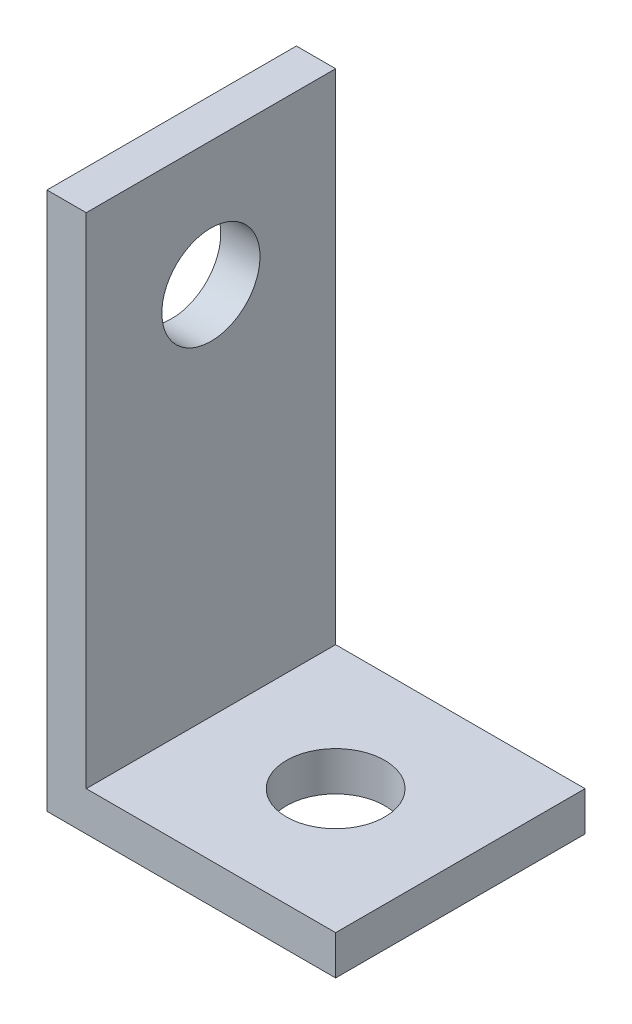
ISO-10303-21;
HEADER;
FILE_DESCRIPTION(('STEP AP214'),'2;1');
FILE_NAME('part.step','',(''),(''),'','','');
FILE_SCHEMA(('AUTOMOTIVE_DESIGN { 1 0 10303 214 1 1 1 1 }'));
ENDSEC;
DATA;
#1=APPLICATION_CONTEXT('core data for automotive mechanical design processes');
#2=APPLICATION_PROTOCOL_DEFINITION('international standard','automotive_design',2000,#1);
#3=PRODUCT_CONTEXT('',#1,'mechanical');
#4=PRODUCT('Part','Part','',(#3));
#5=PRODUCT_RELATED_PRODUCT_CATEGORY('part','',(#4));
#6=PRODUCT_DEFINITION_FORMATION('','',#4);
#7=PRODUCT_DEFINITION_CONTEXT('part definition',#1,'design');
#8=PRODUCT_DEFINITION('design','',#6,#7);
#9=PRODUCT_DEFINITION_SHAPE('','',#8);
#10=(LENGTH_UNIT() NAMED_UNIT(*) SI_UNIT(.MILLI.,.METRE.));
#11=(NAMED_UNIT(*) PLANE_ANGLE_UNIT() SI_UNIT($,.RADIAN.));
#12=(NAMED_UNIT(*) SI_UNIT($,.STERADIAN.) SOLID_ANGLE_UNIT());
#13=UNCERTAINTY_MEASURE_WITH_UNIT(LENGTH_MEASURE(1.E-05),#10,'distance_accuracy_value','');
#14=(GEOMETRIC_REPRESENTATION_CONTEXT(3) GLOBAL_UNCERTAINTY_ASSIGNED_CONTEXT((#13)) GLOBAL_UNIT_ASSIGNED_CONTEXT((#10,
#11,#12)) REPRESENTATION_CONTEXT('',''));
#15=CARTESIAN_POINT('',(0.,0.,0.));
#16=DIRECTION('',(0.,0.,1.));
#17=DIRECTION('',(1.,0.,0.));
#18=AXIS2_PLACEMENT_3D('',#15,#16,#17);
#19=CARTESIAN_POINT('',(0.,0.,12.7));
#20=DIRECTION('',(0.,1.,0.));
#21=DIRECTION('',(0.,0.,1.));
#22=AXIS2_PLACEMENT_3D('',#19,#20,#21);
#23=PLANE('',#22);
#24=CARTESIAN_POINT('',(8.35,0.,6.35));
#25=DIRECTION('',(0.,1.,0.));
#26=DIRECTION('',(0.,0.,1.));
#27=AXIS2_PLACEMENT_3D('',#24,#25,#26);
#28=CIRCLE('',#27,2.5);
#29=CARTESIAN_POINT('',(8.35,0.,8.85));
#30=VERTEX_POINT('',#29);
#31=EDGE_CURVE('E132',#30,#30,#28,.T.);
#32=ORIENTED_EDGE('',*,*,#31,.T.);
#33=EDGE_LOOP('',(#32));
#34=FACE_BOUND('',#33,.T.);
#35=DIRECTION('',(1.,0.,0.));
#36=VECTOR('',#35,1.);
#37=CARTESIAN_POINT('',(0.,0.,0.));
#38=LINE('',#37,#36);
#39=CARTESIAN_POINT('',(0.,0.,0.));
#40=VERTEX_POINT('',#39);
#41=CARTESIAN_POINT('',(14.7,0.,0.));
#42=VERTEX_POINT('',#41);
#43=EDGE_CURVE('E83',#40,#42,#38,.T.);
#44=ORIENTED_EDGE('',*,*,#43,.T.);
#45=DIRECTION('',(0.,0.,-1.));
#46=VECTOR('',#45,1.);
#47=CARTESIAN_POINT('',(14.7,0.,12.7));
#48=LINE('',#47,#46);
#49=CARTESIAN_POINT('',(14.7,0.,12.7));
#50=VERTEX_POINT('',#49);
#51=EDGE_CURVE('E45',#50,#42,#48,.T.);
#52=ORIENTED_EDGE('',*,*,#51,.F.);
#53=DIRECTION('',(1.,0.,0.));
#54=VECTOR('',#53,1.);
#55=CARTESIAN_POINT('',(0.,0.,12.7));
#56=LINE('',#55,#54);
#57=CARTESIAN_POINT('',(0.,0.,12.7));
#58=VERTEX_POINT('',#57);
#59=EDGE_CURVE('E86',#58,#50,#56,.T.);
#60=ORIENTED_EDGE('',*,*,#59,.F.);
#61=DIRECTION('',(0.,0.,-1.));
#62=VECTOR('',#61,1.);
#63=CARTESIAN_POINT('',(0.,0.,12.7));
#64=LINE('',#63,#62);
#65=EDGE_CURVE('E113',#58,#40,#64,.T.);
#66=ORIENTED_EDGE('',*,*,#65,.T.);
#67=EDGE_LOOP('',(#44,#52,#60,#66));
#68=FACE_BOUND('',#67,.T.);
#69=ADVANCED_FACE('F35',(#34,#68),#23,.F.);
#70=CARTESIAN_POINT('',(14.7,0.,12.7));
#71=DIRECTION('',(-1.,0.,0.));
#72=DIRECTION('',(0.,0.,1.));
#73=AXIS2_PLACEMENT_3D('',#70,#71,#72);
#74=PLANE('',#73);
#75=DIRECTION('',(0.,1.,0.));
#76=VECTOR('',#75,1.);
#77=CARTESIAN_POINT('',(14.7,0.,0.));
#78=LINE('',#77,#76);
#79=CARTESIAN_POINT('',(14.7,2.,0.));
#80=VERTEX_POINT('',#79);
#81=EDGE_CURVE('E118',#42,#80,#78,.T.);
#82=ORIENTED_EDGE('',*,*,#81,.T.);
#83=DIRECTION('',(0.,0.,-1.));
#84=VECTOR('',#83,1.);
#85=CARTESIAN_POINT('',(14.7,2.,12.7));
#86=LINE('',#85,#84);
#87=CARTESIAN_POINT('',(14.7,2.,12.7));
#88=VERTEX_POINT('',#87);
#89=EDGE_CURVE('E110',#88,#80,#86,.T.);
#90=ORIENTED_EDGE('',*,*,#89,.F.);
#91=DIRECTION('',(0.,1.,0.));
#92=VECTOR('',#91,1.);
#93=CARTESIAN_POINT('',(14.7,0.,12.7));
#94=LINE('',#93,#92);
#95=EDGE_CURVE('E125',#50,#88,#94,.T.);
#96=ORIENTED_EDGE('',*,*,#95,.F.);
#97=ORIENTED_EDGE('',*,*,#51,.T.);
#98=EDGE_LOOP('',(#82,#90,#96,#97));
#99=FACE_BOUND('',#98,.T.);
#100=ADVANCED_FACE('F143',(#99),#74,.F.);
#101=CARTESIAN_POINT('',(0.,2.,12.7));
#102=DIRECTION('',(0.,1.,0.));
#103=DIRECTION('',(0.,0.,1.));
#104=AXIS2_PLACEMENT_3D('',#101,#102,#103);
#105=PLANE('',#104);
#106=CARTESIAN_POINT('',(8.35,2.,6.35));
#107=DIRECTION('',(0.,1.,0.));
#108=DIRECTION('',(0.,0.,1.));
#109=AXIS2_PLACEMENT_3D('',#106,#107,#108);
#110=CIRCLE('',#109,2.49999999999999);
#111=CARTESIAN_POINT('',(8.35,2.,8.84999999999999));
#112=VERTEX_POINT('',#111);
#113=EDGE_CURVE('E135',#112,#112,#110,.T.);
#114=ORIENTED_EDGE('',*,*,#113,.F.);
#115=EDGE_LOOP('',(#114));
#116=FACE_BOUND('',#115,.T.);
#117=DIRECTION('',(0.,0.,-1.));
#118=VECTOR('',#117,1.);
#119=CARTESIAN_POINT('',(2.,2.,12.7));
#120=LINE('',#119,#118);
#121=CARTESIAN_POINT('',(2.,2.,12.7));
#122=VERTEX_POINT('',#121);
#123=CARTESIAN_POINT('',(2.,2.,0.));
#124=VERTEX_POINT('',#123);
#125=EDGE_CURVE('E11',#122,#124,#120,.T.);
#126=ORIENTED_EDGE('',*,*,#125,.F.);
#127=DIRECTION('',(1.,0.,0.));
#128=VECTOR('',#127,1.);
#129=CARTESIAN_POINT('',(0.,2.,12.7));
#130=LINE('',#129,#128);
#131=EDGE_CURVE('E123',#122,#88,#130,.T.);
#132=ORIENTED_EDGE('',*,*,#131,.T.);
#133=ORIENTED_EDGE('',*,*,#89,.T.);
#134=DIRECTION('',(1.,0.,0.));
#135=VECTOR('',#134,1.);
#136=CARTESIAN_POINT('',(0.,2.,0.));
#137=LINE('',#136,#135);
#138=EDGE_CURVE('E87',#124,#80,#137,.T.);
#139=ORIENTED_EDGE('',*,*,#138,.F.);
#140=EDGE_LOOP('',(#126,#132,#133,#139));
#141=FACE_BOUND('',#140,.T.);
#142=ADVANCED_FACE('F141',(#116,#141),#105,.T.);
#143=CARTESIAN_POINT('',(0.,0.,12.7));
#144=DIRECTION('',(-1.,0.,0.));
#145=DIRECTION('',(0.,0.,1.));
#146=AXIS2_PLACEMENT_3D('',#143,#144,#145);
#147=PLANE('',#146);
#148=CARTESIAN_POINT('',(0.,21.05,6.35));
#149=DIRECTION('',(1.,0.,0.));
#150=DIRECTION('',(0.,0.,-1.));
#151=AXIS2_PLACEMENT_3D('',#148,#149,#150);
#152=CIRCLE('',#151,2.5);
#153=CARTESIAN_POINT('',(0.,21.05,3.85));
#154=VERTEX_POINT('',#153);
#155=EDGE_CURVE('E97',#154,#154,#152,.T.);
#156=ORIENTED_EDGE('',*,*,#155,.T.);
#157=EDGE_LOOP('',(#156));
#158=FACE_BOUND('',#157,.T.);
#159=DIRECTION('',(0.,1.,0.));
#160=VECTOR('',#159,1.);
#161=CARTESIAN_POINT('',(0.,0.,0.));
#162=LINE('',#161,#160);
#163=CARTESIAN_POINT('',(0.,27.4,0.));
#164=VERTEX_POINT('',#163);
#165=EDGE_CURVE('E75',#40,#164,#162,.T.);
#166=ORIENTED_EDGE('',*,*,#165,.F.);
#167=ORIENTED_EDGE('',*,*,#65,.F.);
#168=DIRECTION('',(0.,1.,0.));
#169=VECTOR('',#168,1.);
#170=CARTESIAN_POINT('',(0.,0.,12.7));
#171=LINE('',#170,#169);
#172=CARTESIAN_POINT('',(0.,27.4,12.7));
#173=VERTEX_POINT('',#172);
#174=EDGE_CURVE('E93',#58,#173,#171,.T.);
#175=ORIENTED_EDGE('',*,*,#174,.T.);
#176=DIRECTION('',(0.,0.,-1.));
#177=VECTOR('',#176,1.);
#178=CARTESIAN_POINT('',(0.,27.4,12.7));
#179=LINE('',#178,#177);
#180=EDGE_CURVE('E90',#173,#164,#179,.T.);
#181=ORIENTED_EDGE('',*,*,#180,.T.);
#182=EDGE_LOOP('',(#166,#167,#175,#181));
#183=FACE_BOUND('',#182,.T.);
#184=ADVANCED_FACE('F91',(#158,#183),#147,.T.);
#185=CARTESIAN_POINT('',(0.,0.,12.7));
#186=DIRECTION('',(0.,0.,1.));
#187=DIRECTION('',(1.,0.,0.));
#188=AXIS2_PLACEMENT_3D('',#185,#186,#187);
#189=PLANE('',#188);
#190=ORIENTED_EDGE('',*,*,#59,.T.);
#191=ORIENTED_EDGE('',*,*,#95,.T.);
#192=ORIENTED_EDGE('',*,*,#131,.F.);
#193=DIRECTION('',(0.,1.,0.));
#194=VECTOR('',#193,1.);
#195=CARTESIAN_POINT('',(2.,2.,12.7));
#196=LINE('',#195,#194);
#197=CARTESIAN_POINT('',(2.,27.4,12.7));
#198=VERTEX_POINT('',#197);
#199=EDGE_CURVE('E105',#122,#198,#196,.T.);
#200=ORIENTED_EDGE('',*,*,#199,.T.);
#201=DIRECTION('',(1.,0.,0.));
#202=VECTOR('',#201,1.);
#203=CARTESIAN_POINT('',(0.,27.4,12.7));
#204=LINE('',#203,#202);
#205=EDGE_CURVE('E99',#173,#198,#204,.T.);
#206=ORIENTED_EDGE('',*,*,#205,.F.);
#207=ORIENTED_EDGE('',*,*,#174,.F.);
#208=EDGE_LOOP('',(#190,#191,#192,#200,#206,#207));
#209=FACE_BOUND('',#208,.T.);
#210=ADVANCED_FACE('F149',(#209),#189,.T.);
#211=CARTESIAN_POINT('',(0.,0.,0.));
#212=DIRECTION('',(0.,0.,1.));
#213=DIRECTION('',(1.,0.,0.));
#214=AXIS2_PLACEMENT_3D('',#211,#212,#213);
#215=PLANE('',#214);
#216=ORIENTED_EDGE('',*,*,#43,.F.);
#217=ORIENTED_EDGE('',*,*,#165,.T.);
#218=DIRECTION('',(1.,0.,0.));
#219=VECTOR('',#218,1.);
#220=CARTESIAN_POINT('',(0.,27.4,0.));
#221=LINE('',#220,#219);
#222=CARTESIAN_POINT('',(2.,27.4,0.));
#223=VERTEX_POINT('',#222);
#224=EDGE_CURVE('E79',#164,#223,#221,.T.);
#225=ORIENTED_EDGE('',*,*,#224,.T.);
#226=DIRECTION('',(0.,1.,0.));
#227=VECTOR('',#226,1.);
#228=CARTESIAN_POINT('',(2.,2.,0.));
#229=LINE('',#228,#227);
#230=EDGE_CURVE('E96',#124,#223,#229,.T.);
#231=ORIENTED_EDGE('',*,*,#230,.F.);
#232=ORIENTED_EDGE('',*,*,#138,.T.);
#233=ORIENTED_EDGE('',*,*,#81,.F.);
#234=EDGE_LOOP('',(#216,#217,#225,#231,#232,#233));
#235=FACE_BOUND('',#234,.T.);
#236=ADVANCED_FACE('F77',(#235),#215,.F.);
#237=CARTESIAN_POINT('',(0.,27.4,12.7));
#238=DIRECTION('',(0.,1.,0.));
#239=DIRECTION('',(0.,0.,1.));
#240=AXIS2_PLACEMENT_3D('',#237,#238,#239);
#241=PLANE('',#240);
#242=ORIENTED_EDGE('',*,*,#224,.F.);
#243=ORIENTED_EDGE('',*,*,#180,.F.);
#244=ORIENTED_EDGE('',*,*,#205,.T.);
#245=DIRECTION('',(0.,0.,-1.));
#246=VECTOR('',#245,1.);
#247=CARTESIAN_POINT('',(2.,27.4,12.7));
#248=LINE('',#247,#246);
#249=EDGE_CURVE('E39',#198,#223,#248,.T.);
#250=ORIENTED_EDGE('',*,*,#249,.T.);
#251=EDGE_LOOP('',(#242,#243,#244,#250));
#252=FACE_BOUND('',#251,.T.);
#253=ADVANCED_FACE('F37',(#252),#241,.T.);
#254=CARTESIAN_POINT('',(2.,2.,12.7));
#255=DIRECTION('',(-1.,0.,0.));
#256=DIRECTION('',(0.,-1.,0.));
#257=AXIS2_PLACEMENT_3D('',#254,#255,#256);
#258=PLANE('',#257);
#259=CARTESIAN_POINT('',(2.,21.05,6.35));
#260=DIRECTION('',(1.,0.,0.));
#261=DIRECTION('',(0.,0.,-1.));
#262=AXIS2_PLACEMENT_3D('',#259,#260,#261);
#263=CIRCLE('',#262,2.49999999999999);
#264=CARTESIAN_POINT('',(2.,21.05,3.85000000000001));
#265=VERTEX_POINT('',#264);
#266=EDGE_CURVE('E102',#265,#265,#263,.T.);
#267=ORIENTED_EDGE('',*,*,#266,.F.);
#268=EDGE_LOOP('',(#267));
#269=FACE_BOUND('',#268,.T.);
#270=ORIENTED_EDGE('',*,*,#230,.T.);
#271=ORIENTED_EDGE('',*,*,#249,.F.);
#272=ORIENTED_EDGE('',*,*,#199,.F.);
#273=ORIENTED_EDGE('',*,*,#125,.T.);
#274=EDGE_LOOP('',(#270,#271,#272,#273));
#275=FACE_BOUND('',#274,.T.);
#276=ADVANCED_FACE('F155',(#269,#275),#258,.F.);
#277=CARTESIAN_POINT('',(2.,21.05,6.35));
#278=DIRECTION('',(1.,0.,0.));
#279=DIRECTION('',(0.,0.,-1.));
#280=AXIS2_PLACEMENT_3D('',#277,#278,#279);
#281=CYLINDRICAL_SURFACE('',#280,2.49999999999999);
#282=ORIENTED_EDGE('',*,*,#155,.F.);
#283=EDGE_LOOP('',(#282));
#284=FACE_BOUND('',#283,.T.);
#285=ORIENTED_EDGE('',*,*,#266,.T.);
#286=EDGE_LOOP('',(#285));
#287=FACE_BOUND('',#286,.T.);
#288=ADVANCED_FACE('F160',(#284,#287),#281,.F.);
#289=CARTESIAN_POINT('',(8.35,2.,6.35));
#290=DIRECTION('',(0.,1.,0.));
#291=DIRECTION('',(0.,0.,1.));
#292=AXIS2_PLACEMENT_3D('',#289,#290,#291);
#293=CYLINDRICAL_SURFACE('',#292,2.49999999999999);
#294=ORIENTED_EDGE('',*,*,#31,.F.);
#295=EDGE_LOOP('',(#294));
#296=FACE_BOUND('',#295,.T.);
#297=ORIENTED_EDGE('',*,*,#113,.T.);
#298=EDGE_LOOP('',(#297));
#299=FACE_BOUND('',#298,.T.);
#300=ADVANCED_FACE('F139',(#296,#299),#293,.F.);
#301=CLOSED_SHELL('',(#69,#100,#142,#184,#210,#236,#253,#276,#288,#300));
#302=MANIFOLD_SOLID_BREP('B2',#301);
#303=ADVANCED_BREP_SHAPE_REPRESENTATION('',(#18,#302),#14);
#304=SHAPE_DEFINITION_REPRESENTATION(#9,#303);
ENDSEC;
END-ISO-10303-21;
